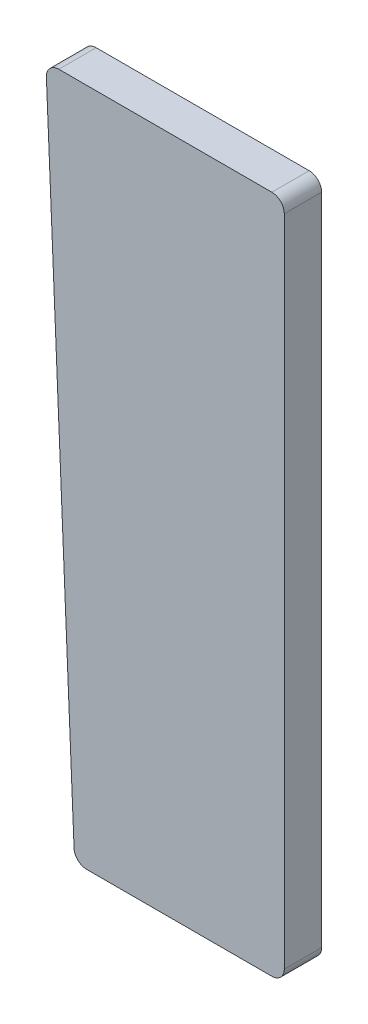
ISO-10303-21;
HEADER;
FILE_DESCRIPTION(('STEP AP214'),'2;1');
FILE_NAME('part.step','',(''),(''),'','','');
FILE_SCHEMA(('AUTOMOTIVE_DESIGN { 1 0 10303 214 1 1 1 1 }'));
ENDSEC;
DATA;
#1=APPLICATION_CONTEXT('core data for automotive mechanical design processes');
#2=APPLICATION_PROTOCOL_DEFINITION('international standard','automotive_design',2000,#1);
#3=PRODUCT_CONTEXT('',#1,'mechanical');
#4=PRODUCT('Part','Part','',(#3));
#5=PRODUCT_RELATED_PRODUCT_CATEGORY('part','',(#4));
#6=PRODUCT_DEFINITION_FORMATION('','',#4);
#7=PRODUCT_DEFINITION_CONTEXT('part definition',#1,'design');
#8=PRODUCT_DEFINITION('design','',#6,#7);
#9=PRODUCT_DEFINITION_SHAPE('','',#8);
#10=(LENGTH_UNIT() NAMED_UNIT(*) SI_UNIT(.MILLI.,.METRE.));
#11=(NAMED_UNIT(*) PLANE_ANGLE_UNIT() SI_UNIT($,.RADIAN.));
#12=(NAMED_UNIT(*) SI_UNIT($,.STERADIAN.) SOLID_ANGLE_UNIT());
#13=UNCERTAINTY_MEASURE_WITH_UNIT(LENGTH_MEASURE(1.E-05),#10,'distance_accuracy_value','');
#14=(GEOMETRIC_REPRESENTATION_CONTEXT(3) GLOBAL_UNCERTAINTY_ASSIGNED_CONTEXT((#13)) GLOBAL_UNIT_ASSIGNED_CONTEXT((#10,
#11,#12)) REPRESENTATION_CONTEXT('',''));
#15=CARTESIAN_POINT('',(0.,0.,0.));
#16=DIRECTION('',(0.,0.,1.));
#17=DIRECTION('',(1.,0.,0.));
#18=AXIS2_PLACEMENT_3D('',#15,#16,#17);
#19=CARTESIAN_POINT('',(0.,0.,30.));
#20=DIRECTION('',(-1.,0.,0.));
#21=DIRECTION('',(0.,0.,1.));
#22=AXIS2_PLACEMENT_3D('',#19,#20,#21);
#23=PLANE('',#22);
#24=DIRECTION('',(0.,1.,0.));
#25=VECTOR('',#24,1.);
#26=CARTESIAN_POINT('',(0.,0.,30.));
#27=LINE('',#26,#25);
#28=CARTESIAN_POINT('',(0.,-236.950296353161,30.));
#29=VERTEX_POINT('',#28);
#30=CARTESIAN_POINT('',(0.,289.049703646839,30.));
#31=VERTEX_POINT('',#30);
#32=EDGE_CURVE('E139',#29,#31,#27,.T.);
#33=ORIENTED_EDGE('',*,*,#32,.F.);
#34=DIRECTION('',(0.,0.,-1.));
#35=VECTOR('',#34,1.);
#36=CARTESIAN_POINT('',(0.,-236.950296353161,30.));
#37=LINE('',#36,#35);
#38=CARTESIAN_POINT('',(0.,-236.950296353161,0.));
#39=VERTEX_POINT('',#38);
#40=EDGE_CURVE('E11',#29,#39,#37,.T.);
#41=ORIENTED_EDGE('',*,*,#40,.T.);
#42=DIRECTION('',(0.,1.,0.));
#43=VECTOR('',#42,1.);
#44=CARTESIAN_POINT('',(0.,0.,0.));
#45=LINE('',#44,#43);
#46=CARTESIAN_POINT('',(0.,289.049703646839,0.));
#47=VERTEX_POINT('',#46);
#48=EDGE_CURVE('E130',#39,#47,#45,.T.);
#49=ORIENTED_EDGE('',*,*,#48,.T.);
#50=DIRECTION('',(0.,0.,-1.));
#51=VECTOR('',#50,1.);
#52=CARTESIAN_POINT('',(0.,289.049703646839,30.));
#53=LINE('',#52,#51);
#54=EDGE_CURVE('E110',#47,#31,#53,.F.);
#55=ORIENTED_EDGE('',*,*,#54,.T.);
#56=EDGE_LOOP('',(#33,#41,#49,#55));
#57=FACE_BOUND('',#56,.T.);
#58=ADVANCED_FACE('F35',(#57),#23,.F.);
#59=CARTESIAN_POINT('',(0.,299.049703646839,30.));
#60=DIRECTION('',(0.,-1.,0.));
#61=DIRECTION('',(0.,0.,-1.));
#62=AXIS2_PLACEMENT_3D('',#59,#60,#61);
#63=PLANE('',#62);
#64=DIRECTION('',(-1.,0.,0.));
#65=VECTOR('',#64,1.);
#66=CARTESIAN_POINT('',(0.,299.049703646839,30.));
#67=LINE('',#66,#65);
#68=CARTESIAN_POINT('',(-10.,299.049703646839,30.));
#69=VERTEX_POINT('',#68);
#70=CARTESIAN_POINT('',(-181.302786480469,299.049703646839,30.));
#71=VERTEX_POINT('',#70);
#72=EDGE_CURVE('E123',#69,#71,#67,.T.);
#73=ORIENTED_EDGE('',*,*,#72,.F.);
#74=DIRECTION('',(0.,0.,-1.));
#75=VECTOR('',#74,1.);
#76=CARTESIAN_POINT('',(-10.,299.049703646839,30.));
#77=LINE('',#76,#75);
#78=CARTESIAN_POINT('',(-10.,299.049703646839,0.));
#79=VERTEX_POINT('',#78);
#80=EDGE_CURVE('E108',#69,#79,#77,.T.);
#81=ORIENTED_EDGE('',*,*,#80,.T.);
#82=DIRECTION('',(-1.,0.,0.));
#83=VECTOR('',#82,1.);
#84=CARTESIAN_POINT('',(0.,299.049703646839,0.));
#85=LINE('',#84,#83);
#86=CARTESIAN_POINT('',(-181.302786480469,299.049703646839,0.));
#87=VERTEX_POINT('',#86);
#88=EDGE_CURVE('E120',#79,#87,#85,.T.);
#89=ORIENTED_EDGE('',*,*,#88,.T.);
#90=DIRECTION('',(0.,0.,-1.));
#91=VECTOR('',#90,1.);
#92=CARTESIAN_POINT('',(-181.302786480469,299.049703646839,30.));
#93=LINE('',#92,#91);
#94=EDGE_CURVE('E124',#87,#71,#93,.F.);
#95=ORIENTED_EDGE('',*,*,#94,.T.);
#96=EDGE_LOOP('',(#73,#81,#89,#95));
#97=FACE_BOUND('',#96,.T.);
#98=ADVANCED_FACE('F119',(#97),#63,.F.);
#99=CARTESIAN_POINT('',(-191.735,299.049703646839,30.));
#100=DIRECTION('',(0.999105456297817,0.0422881448627154,0.));
#101=DIRECTION('',(-0.0422881448627154,0.999105456297817,0.));
#102=AXIS2_PLACEMENT_3D('',#99,#100,#101);
#103=PLANE('',#102);
#104=DIRECTION('',(0.0422881448627154,-0.999105456297817,0.));
#105=VECTOR('',#104,1.);
#106=CARTESIAN_POINT('',(-191.735,299.049703646839,0.));
#107=LINE('',#106,#105);
#108=CARTESIAN_POINT('',(-191.293841043447,288.626822198212,0.));
#109=VERTEX_POINT('',#108);
#110=CARTESIAN_POINT('',(-169.030361189967,-237.373177801788,0.));
#111=VERTEX_POINT('',#110);
#112=EDGE_CURVE('E129',#109,#111,#107,.T.);
#113=ORIENTED_EDGE('',*,*,#112,.T.);
#114=DIRECTION('',(0.,0.,-1.));
#115=VECTOR('',#114,1.);
#116=CARTESIAN_POINT('',(-169.030361189967,-237.373177801788,30.));
#117=LINE('',#116,#115);
#118=CARTESIAN_POINT('',(-169.030361189967,-237.373177801788,30.));
#119=VERTEX_POINT('',#118);
#120=EDGE_CURVE('E58',#111,#119,#117,.F.);
#121=ORIENTED_EDGE('',*,*,#120,.T.);
#122=DIRECTION('',(0.0422881448627154,-0.999105456297817,0.));
#123=VECTOR('',#122,1.);
#124=CARTESIAN_POINT('',(-191.735,299.049703646839,30.));
#125=LINE('',#124,#123);
#126=CARTESIAN_POINT('',(-191.293841043447,288.626822198212,30.));
#127=VERTEX_POINT('',#126);
#128=EDGE_CURVE('E164',#127,#119,#125,.T.);
#129=ORIENTED_EDGE('',*,*,#128,.F.);
#130=DIRECTION('',(0.,0.,-1.));
#131=VECTOR('',#130,1.);
#132=CARTESIAN_POINT('',(-191.293841043447,288.626822198212,30.));
#133=LINE('',#132,#131);
#134=EDGE_CURVE('E148',#127,#109,#133,.T.);
#135=ORIENTED_EDGE('',*,*,#134,.T.);
#136=EDGE_LOOP('',(#113,#121,#129,#135));
#137=FACE_BOUND('',#136,.T.);
#138=ADVANCED_FACE('F171',(#137),#103,.F.);
#139=CARTESIAN_POINT('',(0.,-246.950296353161,30.));
#140=DIRECTION('',(0.,1.,0.));
#141=DIRECTION('',(0.,0.,1.));
#142=AXIS2_PLACEMENT_3D('',#139,#140,#141);
#143=PLANE('',#142);
#144=DIRECTION('',(1.,0.,0.));
#145=VECTOR('',#144,1.);
#146=CARTESIAN_POINT('',(0.,-246.950296353161,30.));
#147=LINE('',#146,#145);
#148=CARTESIAN_POINT('',(-159.039306626989,-246.950296353161,30.));
#149=VERTEX_POINT('',#148);
#150=CARTESIAN_POINT('',(-10.,-246.950296353161,30.));
#151=VERTEX_POINT('',#150);
#152=EDGE_CURVE('E140',#149,#151,#147,.T.);
#153=ORIENTED_EDGE('',*,*,#152,.F.);
#154=DIRECTION('',(0.,0.,-1.));
#155=VECTOR('',#154,1.);
#156=CARTESIAN_POINT('',(-159.039306626989,-246.950296353161,30.));
#157=LINE('',#156,#155);
#158=CARTESIAN_POINT('',(-159.039306626989,-246.950296353161,0.));
#159=VERTEX_POINT('',#158);
#160=EDGE_CURVE('E153',#149,#159,#157,.T.);
#161=ORIENTED_EDGE('',*,*,#160,.T.);
#162=DIRECTION('',(1.,0.,0.));
#163=VECTOR('',#162,1.);
#164=CARTESIAN_POINT('',(0.,-246.950296353161,0.));
#165=LINE('',#164,#163);
#166=CARTESIAN_POINT('',(-10.,-246.950296353161,0.));
#167=VERTEX_POINT('',#166);
#168=EDGE_CURVE('E132',#159,#167,#165,.T.);
#169=ORIENTED_EDGE('',*,*,#168,.T.);
#170=DIRECTION('',(0.,0.,-1.));
#171=VECTOR('',#170,1.);
#172=CARTESIAN_POINT('',(-10.,-246.950296353161,30.));
#173=LINE('',#172,#171);
#174=EDGE_CURVE('E151',#167,#151,#173,.F.);
#175=ORIENTED_EDGE('',*,*,#174,.T.);
#176=EDGE_LOOP('',(#153,#161,#169,#175));
#177=FACE_BOUND('',#176,.T.);
#178=ADVANCED_FACE('F168',(#177),#143,.F.);
#179=CARTESIAN_POINT('',(0.,0.,30.));
#180=DIRECTION('',(0.,0.,-1.));
#181=DIRECTION('',(-1.,0.,0.));
#182=AXIS2_PLACEMENT_3D('',#179,#180,#181);
#183=PLANE('',#182);
#184=ORIENTED_EDGE('',*,*,#128,.T.);
#185=CARTESIAN_POINT('',(-159.039306626989,-236.950296353161,30.));
#186=DIRECTION('',(0.,0.,-1.));
#187=DIRECTION('',(-1.,0.,0.));
#188=AXIS2_PLACEMENT_3D('',#185,#186,#187);
#189=CIRCLE('',#188,10.);
#190=EDGE_CURVE('E43',#119,#149,#189,.F.);
#191=ORIENTED_EDGE('',*,*,#190,.T.);
#192=ORIENTED_EDGE('',*,*,#152,.T.);
#193=CARTESIAN_POINT('',(-10.,-236.950296353161,30.));
#194=DIRECTION('',(0.,0.,-1.));
#195=DIRECTION('',(-1.,0.,0.));
#196=AXIS2_PLACEMENT_3D('',#193,#194,#195);
#197=CIRCLE('',#196,10.);
#198=EDGE_CURVE('E50',#151,#29,#197,.F.);
#199=ORIENTED_EDGE('',*,*,#198,.T.);
#200=ORIENTED_EDGE('',*,*,#32,.T.);
#201=CARTESIAN_POINT('',(-10.,289.049703646839,30.));
#202=DIRECTION('',(0.,0.,-1.));
#203=DIRECTION('',(-1.,0.,0.));
#204=AXIS2_PLACEMENT_3D('',#201,#202,#203);
#205=CIRCLE('',#204,10.);
#206=EDGE_CURVE('E146',#31,#69,#205,.F.);
#207=ORIENTED_EDGE('',*,*,#206,.T.);
#208=ORIENTED_EDGE('',*,*,#72,.T.);
#209=CARTESIAN_POINT('',(-181.302786480469,289.049703646839,30.));
#210=DIRECTION('',(0.,0.,-1.));
#211=DIRECTION('',(-1.,0.,0.));
#212=AXIS2_PLACEMENT_3D('',#209,#210,#211);
#213=CIRCLE('',#212,10.);
#214=EDGE_CURVE('E144',#71,#127,#213,.F.);
#215=ORIENTED_EDGE('',*,*,#214,.T.);
#216=EDGE_LOOP('',(#184,#191,#192,#199,#200,#207,#208,#215));
#217=FACE_BOUND('',#216,.T.);
#218=ADVANCED_FACE('F163',(#217),#183,.F.);
#219=CARTESIAN_POINT('',(0.,0.,0.));
#220=DIRECTION('',(0.,0.,-1.));
#221=DIRECTION('',(-1.,0.,0.));
#222=AXIS2_PLACEMENT_3D('',#219,#220,#221);
#223=PLANE('',#222);
#224=ORIENTED_EDGE('',*,*,#168,.F.);
#225=CARTESIAN_POINT('',(-159.039306626989,-236.950296353161,0.));
#226=DIRECTION('',(0.,0.,-1.));
#227=DIRECTION('',(-1.,0.,0.));
#228=AXIS2_PLACEMENT_3D('',#225,#226,#227);
#229=CIRCLE('',#228,10.);
#230=EDGE_CURVE('E158',#159,#111,#229,.T.);
#231=ORIENTED_EDGE('',*,*,#230,.T.);
#232=ORIENTED_EDGE('',*,*,#112,.F.);
#233=CARTESIAN_POINT('',(-181.302786480469,289.049703646839,0.));
#234=DIRECTION('',(0.,0.,-1.));
#235=DIRECTION('',(-1.,0.,0.));
#236=AXIS2_PLACEMENT_3D('',#233,#234,#235);
#237=CIRCLE('',#236,10.);
#238=EDGE_CURVE('E114',#109,#87,#237,.T.);
#239=ORIENTED_EDGE('',*,*,#238,.T.);
#240=ORIENTED_EDGE('',*,*,#88,.F.);
#241=CARTESIAN_POINT('',(-10.,289.049703646839,0.));
#242=DIRECTION('',(0.,0.,-1.));
#243=DIRECTION('',(-1.,0.,0.));
#244=AXIS2_PLACEMENT_3D('',#241,#242,#243);
#245=CIRCLE('',#244,10.);
#246=EDGE_CURVE('E104',#79,#47,#245,.T.);
#247=ORIENTED_EDGE('',*,*,#246,.T.);
#248=ORIENTED_EDGE('',*,*,#48,.F.);
#249=CARTESIAN_POINT('',(-10.,-236.950296353161,0.));
#250=DIRECTION('',(0.,0.,-1.));
#251=DIRECTION('',(-1.,0.,0.));
#252=AXIS2_PLACEMENT_3D('',#249,#250,#251);
#253=CIRCLE('',#252,10.);
#254=EDGE_CURVE('E156',#39,#167,#253,.T.);
#255=ORIENTED_EDGE('',*,*,#254,.T.);
#256=EDGE_LOOP('',(#224,#231,#232,#239,#240,#247,#248,#255));
#257=FACE_BOUND('',#256,.T.);
#258=ADVANCED_FACE('F127',(#257),#223,.T.);
#259=CARTESIAN_POINT('',(-10.,289.049703646839,30.));
#260=DIRECTION('',(0.,0.,-1.));
#261=DIRECTION('',(-1.,0.,0.));
#262=AXIS2_PLACEMENT_3D('',#259,#260,#261);
#263=CYLINDRICAL_SURFACE('',#262,10.);
#264=ORIENTED_EDGE('',*,*,#206,.F.);
#265=ORIENTED_EDGE('',*,*,#54,.F.);
#266=ORIENTED_EDGE('',*,*,#246,.F.);
#267=ORIENTED_EDGE('',*,*,#80,.F.);
#268=EDGE_LOOP('',(#264,#265,#266,#267));
#269=FACE_BOUND('',#268,.T.);
#270=ADVANCED_FACE('F107',(#269),#263,.T.);
#271=CARTESIAN_POINT('',(-181.302786480469,289.049703646839,30.));
#272=DIRECTION('',(0.,0.,-1.));
#273=DIRECTION('',(-1.,0.,0.));
#274=AXIS2_PLACEMENT_3D('',#271,#272,#273);
#275=CYLINDRICAL_SURFACE('',#274,10.);
#276=ORIENTED_EDGE('',*,*,#214,.F.);
#277=ORIENTED_EDGE('',*,*,#94,.F.);
#278=ORIENTED_EDGE('',*,*,#238,.F.);
#279=ORIENTED_EDGE('',*,*,#134,.F.);
#280=EDGE_LOOP('',(#276,#277,#278,#279));
#281=FACE_BOUND('',#280,.T.);
#282=ADVANCED_FACE('F175',(#281),#275,.T.);
#283=CARTESIAN_POINT('',(-159.039306626989,-236.950296353161,30.));
#284=DIRECTION('',(0.,0.,-1.));
#285=DIRECTION('',(-1.,0.,0.));
#286=AXIS2_PLACEMENT_3D('',#283,#284,#285);
#287=CYLINDRICAL_SURFACE('',#286,10.);
#288=ORIENTED_EDGE('',*,*,#190,.F.);
#289=ORIENTED_EDGE('',*,*,#120,.F.);
#290=ORIENTED_EDGE('',*,*,#230,.F.);
#291=ORIENTED_EDGE('',*,*,#160,.F.);
#292=EDGE_LOOP('',(#288,#289,#290,#291));
#293=FACE_BOUND('',#292,.T.);
#294=ADVANCED_FACE('F170',(#293),#287,.T.);
#295=CARTESIAN_POINT('',(-10.,-236.950296353161,30.));
#296=DIRECTION('',(0.,0.,-1.));
#297=DIRECTION('',(-1.,0.,0.));
#298=AXIS2_PLACEMENT_3D('',#295,#296,#297);
#299=CYLINDRICAL_SURFACE('',#298,10.);
#300=ORIENTED_EDGE('',*,*,#198,.F.);
#301=ORIENTED_EDGE('',*,*,#174,.F.);
#302=ORIENTED_EDGE('',*,*,#254,.F.);
#303=ORIENTED_EDGE('',*,*,#40,.F.);
#304=EDGE_LOOP('',(#300,#301,#302,#303));
#305=FACE_BOUND('',#304,.T.);
#306=ADVANCED_FACE('F37',(#305),#299,.T.);
#307=CLOSED_SHELL('',(#58,#98,#138,#178,#218,#258,#270,#282,#294,#306));
#308=MANIFOLD_SOLID_BREP('B2',#307);
#309=ADVANCED_BREP_SHAPE_REPRESENTATION('',(#18,#308),#14);
#310=SHAPE_DEFINITION_REPRESENTATION(#9,#309);
ENDSEC;
END-ISO-10303-21;
